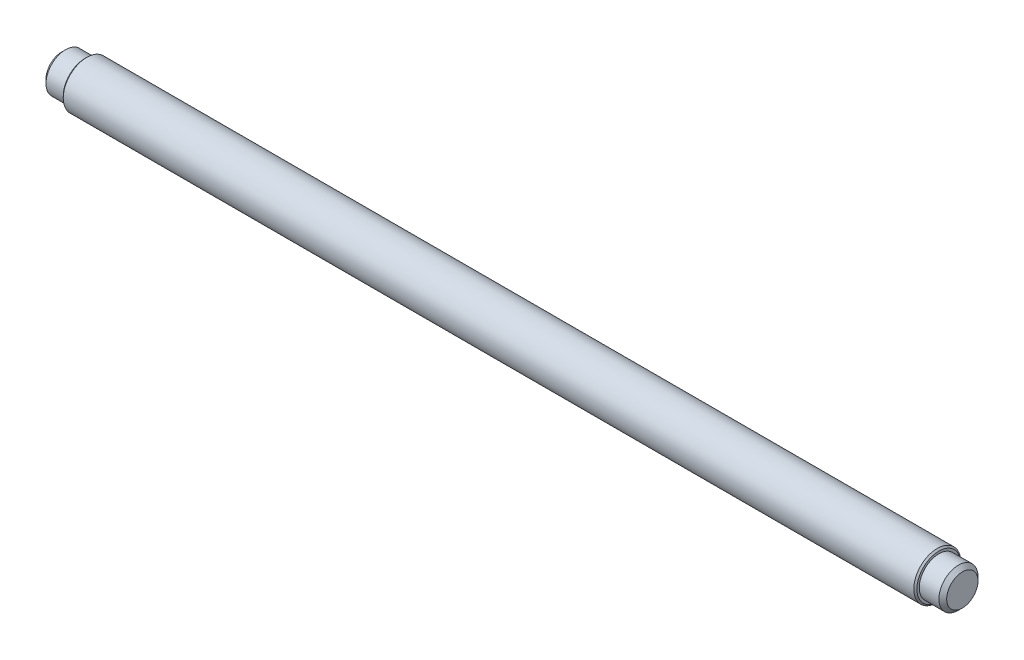
ISO-10303-21;
HEADER;
FILE_DESCRIPTION(('STEP AP214'),'2;1');
FILE_NAME('part.step','',(''),(''),'','','');
FILE_SCHEMA(('AUTOMOTIVE_DESIGN { 1 0 10303 214 1 1 1 1 }'));
ENDSEC;
DATA;
#1=APPLICATION_CONTEXT('core data for automotive mechanical design processes');
#2=APPLICATION_PROTOCOL_DEFINITION('international standard','automotive_design',2000,#1);
#3=PRODUCT_CONTEXT('',#1,'mechanical');
#4=PRODUCT('Part','Part','',(#3));
#5=PRODUCT_RELATED_PRODUCT_CATEGORY('part','',(#4));
#6=PRODUCT_DEFINITION_FORMATION('','',#4);
#7=PRODUCT_DEFINITION_CONTEXT('part definition',#1,'design');
#8=PRODUCT_DEFINITION('design','',#6,#7);
#9=PRODUCT_DEFINITION_SHAPE('','',#8);
#10=(LENGTH_UNIT() NAMED_UNIT(*) SI_UNIT(.MILLI.,.METRE.));
#11=(NAMED_UNIT(*) PLANE_ANGLE_UNIT() SI_UNIT($,.RADIAN.));
#12=(NAMED_UNIT(*) SI_UNIT($,.STERADIAN.) SOLID_ANGLE_UNIT());
#13=UNCERTAINTY_MEASURE_WITH_UNIT(LENGTH_MEASURE(1.E-05),#10,'distance_accuracy_value','');
#14=(GEOMETRIC_REPRESENTATION_CONTEXT(3) GLOBAL_UNCERTAINTY_ASSIGNED_CONTEXT((#13)) GLOBAL_UNIT_ASSIGNED_CONTEXT((#10,
#11,#12)) REPRESENTATION_CONTEXT('',''));
#15=CARTESIAN_POINT('',(0.,0.,0.));
#16=DIRECTION('',(0.,0.,1.));
#17=DIRECTION('',(1.,0.,0.));
#18=AXIS2_PLACEMENT_3D('',#15,#16,#17);
#19=CARTESIAN_POINT('',(115.,2.5,0.));
#20=DIRECTION('',(-1.,0.,0.));
#21=DIRECTION('',(0.,0.,1.));
#22=AXIS2_PLACEMENT_3D('',#19,#20,#21);
#23=PLANE('',#22);
#24=CARTESIAN_POINT('',(115.,0.,0.));
#25=DIRECTION('',(-1.,0.,0.));
#26=DIRECTION('',(0.,0.,1.));
#27=AXIS2_PLACEMENT_3D('',#24,#25,#26);
#28=CIRCLE('',#27,1.99999999999999);
#29=CARTESIAN_POINT('',(115.,0.,1.99999999999999));
#30=VERTEX_POINT('',#29);
#31=EDGE_CURVE('E10',#30,#30,#28,.F.);
#32=ORIENTED_EDGE('',*,*,#31,.T.);
#33=EDGE_LOOP('',(#32));
#34=FACE_BOUND('',#33,.T.);
#35=ADVANCED_FACE('F35',(#34),#23,.F.);
#36=CARTESIAN_POINT('',(0.,0.,0.));
#37=DIRECTION('',(-1.,0.,0.));
#38=DIRECTION('',(0.,0.,1.));
#39=AXIS2_PLACEMENT_3D('',#36,#37,#38);
#40=CYLINDRICAL_SURFACE('',#39,2.5);
#41=CARTESIAN_POINT('',(114.5,0.,0.));
#42=DIRECTION('',(-1.,0.,0.));
#43=DIRECTION('',(0.,0.,1.));
#44=AXIS2_PLACEMENT_3D('',#41,#42,#43);
#45=CIRCLE('',#44,2.5);
#46=CARTESIAN_POINT('',(114.5,0.,2.5));
#47=VERTEX_POINT('',#46);
#48=EDGE_CURVE('E42',#47,#47,#45,.T.);
#49=ORIENTED_EDGE('',*,*,#48,.T.);
#50=EDGE_LOOP('',(#49));
#51=FACE_BOUND('',#50,.T.);
#52=CARTESIAN_POINT('',(112.,0.,0.));
#53=DIRECTION('',(-1.,0.,0.));
#54=DIRECTION('',(0.,0.,1.));
#55=AXIS2_PLACEMENT_3D('',#52,#53,#54);
#56=CIRCLE('',#55,2.5);
#57=CARTESIAN_POINT('',(112.,0.,2.5));
#58=VERTEX_POINT('',#57);
#59=EDGE_CURVE('E67',#58,#58,#56,.T.);
#60=ORIENTED_EDGE('',*,*,#59,.F.);
#61=EDGE_LOOP('',(#60));
#62=FACE_BOUND('',#61,.T.);
#63=ADVANCED_FACE('F92',(#51,#62),#40,.T.);
#64=CARTESIAN_POINT('',(112.,2.5,0.));
#65=DIRECTION('',(-1.,0.,0.));
#66=DIRECTION('',(0.,0.,1.));
#67=AXIS2_PLACEMENT_3D('',#64,#65,#66);
#68=PLANE('',#67);
#69=CARTESIAN_POINT('',(112.,0.,0.));
#70=DIRECTION('',(-1.,0.,0.));
#71=DIRECTION('',(0.,0.,1.));
#72=AXIS2_PLACEMENT_3D('',#69,#70,#71);
#73=CIRCLE('',#72,2.80000000000001);
#74=CARTESIAN_POINT('',(112.,0.,2.8));
#75=VERTEX_POINT('',#74);
#76=EDGE_CURVE('E61',#75,#75,#73,.F.);
#77=ORIENTED_EDGE('',*,*,#76,.T.);
#78=EDGE_LOOP('',(#77));
#79=FACE_BOUND('',#78,.T.);
#80=ORIENTED_EDGE('',*,*,#59,.T.);
#81=EDGE_LOOP('',(#80));
#82=FACE_BOUND('',#81,.T.);
#83=ADVANCED_FACE('F88',(#79,#82),#68,.F.);
#84=CARTESIAN_POINT('',(0.,0.,0.));
#85=DIRECTION('',(-1.,0.,0.));
#86=DIRECTION('',(0.,0.,1.));
#87=AXIS2_PLACEMENT_3D('',#84,#85,#86);
#88=CYLINDRICAL_SURFACE('',#87,3.);
#89=CARTESIAN_POINT('',(3.20000000000003,0.,0.));
#90=DIRECTION('',(1.,0.,0.));
#91=DIRECTION('',(0.,0.,-1.));
#92=AXIS2_PLACEMENT_3D('',#89,#90,#91);
#93=CIRCLE('',#92,3.);
#94=CARTESIAN_POINT('',(3.20000000000003,0.,3.));
#95=VERTEX_POINT('',#94);
#96=EDGE_CURVE('E55',#95,#95,#93,.T.);
#97=CARTESIAN_POINT('',(111.8,0.,0.));
#98=DIRECTION('',(-1.,0.,0.));
#99=DIRECTION('',(0.,0.,1.));
#100=AXIS2_PLACEMENT_3D('',#97,#98,#99);
#101=CIRCLE('',#100,3.);
#102=CARTESIAN_POINT('',(111.8,0.,3.));
#103=VERTEX_POINT('',#102);
#104=EDGE_CURVE('E64',#103,#103,#101,.T.);
#105=CARTESIAN_POINT('',(3.20000000000003,0.,3.));
#106=CARTESIAN_POINT('',(4.33125000000003,0.,3.));
#107=CARTESIAN_POINT('',(5.46250000000003,0.,3.));
#108=CARTESIAN_POINT('',(7.72500000000003,0.,3.));
#109=CARTESIAN_POINT('',(8.85625000000003,0.,3.));
#110=CARTESIAN_POINT('',(11.11875,0.,3.));
#111=CARTESIAN_POINT('',(12.25,0.,3.));
#112=CARTESIAN_POINT('',(14.5125,0.,3.));
#113=CARTESIAN_POINT('',(15.64375,0.,3.));
#114=CARTESIAN_POINT('',(17.90625,0.,3.));
#115=CARTESIAN_POINT('',(19.0375,0.,3.));
#116=CARTESIAN_POINT('',(21.3,0.,3.));
#117=CARTESIAN_POINT('',(22.43125,0.,3.));
#118=CARTESIAN_POINT('',(24.69375,0.,3.));
#119=CARTESIAN_POINT('',(25.825,0.,3.));
#120=CARTESIAN_POINT('',(28.0875,0.,3.));
#121=CARTESIAN_POINT('',(29.21875,0.,3.));
#122=CARTESIAN_POINT('',(31.48125,0.,3.));
#123=CARTESIAN_POINT('',(32.6125,0.,3.));
#124=CARTESIAN_POINT('',(34.875,0.,3.));
#125=CARTESIAN_POINT('',(36.00625,0.,3.));
#126=CARTESIAN_POINT('',(38.26875,0.,3.));
#127=CARTESIAN_POINT('',(39.4,0.,3.));
#128=CARTESIAN_POINT('',(41.6625,0.,3.));
#129=CARTESIAN_POINT('',(42.79375,0.,3.));
#130=CARTESIAN_POINT('',(45.05625,0.,3.));
#131=CARTESIAN_POINT('',(46.1875,0.,3.));
#132=CARTESIAN_POINT('',(48.45,0.,3.));
#133=CARTESIAN_POINT('',(49.58125,0.,3.));
#134=CARTESIAN_POINT('',(51.84375,0.,3.));
#135=CARTESIAN_POINT('',(52.975,0.,3.));
#136=CARTESIAN_POINT('',(55.2375,0.,3.));
#137=CARTESIAN_POINT('',(56.36875,0.,3.));
#138=CARTESIAN_POINT('',(58.63125,0.,3.));
#139=CARTESIAN_POINT('',(59.7625,0.,3.));
#140=CARTESIAN_POINT('',(62.025,0.,3.));
#141=CARTESIAN_POINT('',(63.15625,0.,3.));
#142=CARTESIAN_POINT('',(65.41875,0.,3.));
#143=CARTESIAN_POINT('',(66.55,0.,3.));
#144=CARTESIAN_POINT('',(68.8125,0.,3.));
#145=CARTESIAN_POINT('',(69.94375,0.,3.));
#146=CARTESIAN_POINT('',(72.20625,0.,3.));
#147=CARTESIAN_POINT('',(73.3375,0.,3.));
#148=CARTESIAN_POINT('',(75.6,0.,3.));
#149=CARTESIAN_POINT('',(76.73125,0.,3.));
#150=CARTESIAN_POINT('',(78.99375,0.,3.));
#151=CARTESIAN_POINT('',(80.125,0.,3.));
#152=CARTESIAN_POINT('',(82.3875,0.,3.));
#153=CARTESIAN_POINT('',(83.51875,0.,3.));
#154=CARTESIAN_POINT('',(85.78125,0.,3.));
#155=CARTESIAN_POINT('',(86.9125,0.,3.));
#156=CARTESIAN_POINT('',(89.175,0.,3.));
#157=CARTESIAN_POINT('',(90.30625,0.,3.));
#158=CARTESIAN_POINT('',(92.56875,0.,3.));
#159=CARTESIAN_POINT('',(93.7,0.,3.));
#160=CARTESIAN_POINT('',(95.9625,0.,3.));
#161=CARTESIAN_POINT('',(97.09375,0.,3.));
#162=CARTESIAN_POINT('',(99.35625,0.,3.));
#163=CARTESIAN_POINT('',(100.4875,0.,3.));
#164=CARTESIAN_POINT('',(102.75,0.,3.));
#165=CARTESIAN_POINT('',(103.88125,0.,3.));
#166=CARTESIAN_POINT('',(106.14375,0.,3.));
#167=CARTESIAN_POINT('',(107.275,0.,3.));
#168=CARTESIAN_POINT('',(109.5375,0.,3.));
#169=CARTESIAN_POINT('',(110.66875,0.,3.));
#170=CARTESIAN_POINT('',(111.8,0.,3.));
#171=B_SPLINE_CURVE_WITH_KNOTS('',3,(#105,#106,#107,#108,#109,#110,#111,#112,#113,#114,#115,
#116,#117,#118,#119,#120,#121,#122,#123,#124,#125,#126,#127,#128,#129,#130,#131,#132,#133,#134,
#135,#136,#137,#138,#139,#140,#141,#142,#143,#144,#145,#146,#147,#148,#149,#150,#151,#152,#153,
#154,#155,#156,#157,#158,#159,#160,#161,#162,#163,#164,#165,#166,#167,#168,#169,#170),
.UNSPECIFIED.,.F.,.F.,(4,2,2,2,2,2,2,2,2,2,2,2,2,2,2,2,2,2,2,2,2,2,2,2,2,2,2,2,2,2,2,2,4),(0.,
3.39375,6.7875,10.18125,13.575,16.96875,20.3625,23.75625,27.15,30.54375,33.9375,37.33125,40.725,
44.11875,47.5125,50.90625,54.3,57.69375,61.0875,64.48125,67.875,71.26875,74.6625,78.05625,81.45,
84.84375,88.2375,91.63125,95.025,98.41875,101.8125,105.20625,108.6),.UNSPECIFIED.);
#172=EDGE_CURVE('BSEAM78',#95,#103,#171,.T.);
#173=ORIENTED_EDGE('',*,*,#96,.T.);
#174=ORIENTED_EDGE('',*,*,#104,.T.);
#175=ORIENTED_EDGE('',*,*,#172,.T.);
#176=ORIENTED_EDGE('',*,*,#172,.F.);
#177=EDGE_LOOP('',(#173,#175,#174,#176));
#178=FACE_BOUND('',#177,.T.);
#179=ADVANCED_FACE('F78',(#178),#88,.T.);
#180=CARTESIAN_POINT('',(3.,2.99999999999999,0.));
#181=DIRECTION('',(1.,0.,0.));
#182=DIRECTION('',(0.,0.,-1.));
#183=AXIS2_PLACEMENT_3D('',#180,#181,#182);
#184=PLANE('',#183);
#185=CARTESIAN_POINT('',(3.,0.,0.));
#186=DIRECTION('',(1.,0.,0.));
#187=DIRECTION('',(0.,0.,-1.));
#188=AXIS2_PLACEMENT_3D('',#185,#186,#187);
#189=CIRCLE('',#188,2.79999999999998);
#190=CARTESIAN_POINT('',(3.,0.,-2.79999999999998));
#191=VERTEX_POINT('',#190);
#192=EDGE_CURVE('E58',#191,#191,#189,.F.);
#193=ORIENTED_EDGE('',*,*,#192,.T.);
#194=EDGE_LOOP('',(#193));
#195=FACE_BOUND('',#194,.T.);
#196=CARTESIAN_POINT('',(3.,0.,0.));
#197=DIRECTION('',(-1.,0.,0.));
#198=DIRECTION('',(0.,0.,1.));
#199=AXIS2_PLACEMENT_3D('',#196,#197,#198);
#200=CIRCLE('',#199,2.5);
#201=CARTESIAN_POINT('',(3.,0.,2.5));
#202=VERTEX_POINT('',#201);
#203=EDGE_CURVE('E70',#202,#202,#200,.T.);
#204=ORIENTED_EDGE('',*,*,#203,.F.);
#205=EDGE_LOOP('',(#204));
#206=FACE_BOUND('',#205,.T.);
#207=ADVANCED_FACE('F76',(#195,#206),#184,.F.);
#208=CARTESIAN_POINT('',(0.,0.,0.));
#209=DIRECTION('',(-1.,0.,0.));
#210=DIRECTION('',(0.,0.,1.));
#211=AXIS2_PLACEMENT_3D('',#208,#209,#210);
#212=CYLINDRICAL_SURFACE('',#211,2.5);
#213=CARTESIAN_POINT('',(0.499999999999977,0.,0.));
#214=DIRECTION('',(1.,0.,0.));
#215=DIRECTION('',(0.,0.,-1.));
#216=AXIS2_PLACEMENT_3D('',#213,#214,#215);
#217=CIRCLE('',#216,2.5);
#218=CARTESIAN_POINT('',(0.499999999999977,0.,-2.5));
#219=VERTEX_POINT('',#218);
#220=EDGE_CURVE('E46',#219,#219,#217,.T.);
#221=ORIENTED_EDGE('',*,*,#220,.T.);
#222=EDGE_LOOP('',(#221));
#223=FACE_BOUND('',#222,.T.);
#224=ORIENTED_EDGE('',*,*,#203,.T.);
#225=EDGE_LOOP('',(#224));
#226=FACE_BOUND('',#225,.T.);
#227=ADVANCED_FACE('F74',(#223,#226),#212,.T.);
#228=CARTESIAN_POINT('',(0.,2.5,0.));
#229=DIRECTION('',(1.,0.,0.));
#230=DIRECTION('',(0.,0.,-1.));
#231=AXIS2_PLACEMENT_3D('',#228,#229,#230);
#232=PLANE('',#231);
#233=CARTESIAN_POINT('',(0.,0.,0.));
#234=DIRECTION('',(1.,0.,0.));
#235=DIRECTION('',(0.,0.,-1.));
#236=AXIS2_PLACEMENT_3D('',#233,#234,#235);
#237=CIRCLE('',#236,2.00000000000002);
#238=CARTESIAN_POINT('',(0.,0.,-2.00000000000002));
#239=VERTEX_POINT('',#238);
#240=EDGE_CURVE('E50',#239,#239,#237,.F.);
#241=ORIENTED_EDGE('',*,*,#240,.T.);
#242=EDGE_LOOP('',(#241));
#243=FACE_BOUND('',#242,.T.);
#244=ADVANCED_FACE('F85',(#243),#232,.F.);
#245=CARTESIAN_POINT('',(111.8,0.,0.));
#246=DIRECTION('',(-1.,0.,0.));
#247=DIRECTION('',(0.,0.,1.));
#248=AXIS2_PLACEMENT_3D('',#245,#246,#247);
#249=CONICAL_SURFACE('',#248,3.,0.785398163397474);
#250=CARTESIAN_POINT('',(112.,0.,2.8));
#251=CARTESIAN_POINT('',(111.997916666667,0.,2.80208333333334));
#252=CARTESIAN_POINT('',(111.995833333333,0.,2.80416666666667));
#253=CARTESIAN_POINT('',(111.991666666667,0.,2.80833333333334));
#254=CARTESIAN_POINT('',(111.989583333333,0.,2.81041666666667));
#255=CARTESIAN_POINT('',(111.985416666667,0.,2.81458333333334));
#256=CARTESIAN_POINT('',(111.983333333333,0.,2.81666666666667));
#257=CARTESIAN_POINT('',(111.979166666667,0.,2.82083333333334));
#258=CARTESIAN_POINT('',(111.977083333333,0.,2.82291666666667));
#259=CARTESIAN_POINT('',(111.972916666667,0.,2.82708333333334));
#260=CARTESIAN_POINT('',(111.970833333333,0.,2.82916666666667));
#261=CARTESIAN_POINT('',(111.966666666667,0.,2.83333333333334));
#262=CARTESIAN_POINT('',(111.964583333333,0.,2.83541666666667));
#263=CARTESIAN_POINT('',(111.960416666667,0.,2.83958333333333));
#264=CARTESIAN_POINT('',(111.958333333333,0.,2.84166666666667));
#265=CARTESIAN_POINT('',(111.954166666667,0.,2.84583333333333));
#266=CARTESIAN_POINT('',(111.952083333333,0.,2.84791666666667));
#267=CARTESIAN_POINT('',(111.947916666667,0.,2.85208333333333));
#268=CARTESIAN_POINT('',(111.945833333333,0.,2.85416666666667));
#269=CARTESIAN_POINT('',(111.941666666667,0.,2.85833333333333));
#270=CARTESIAN_POINT('',(111.939583333333,0.,2.86041666666667));
#271=CARTESIAN_POINT('',(111.935416666667,0.,2.86458333333333));
#272=CARTESIAN_POINT('',(111.933333333333,0.,2.86666666666667));
#273=CARTESIAN_POINT('',(111.929166666667,0.,2.87083333333333));
#274=CARTESIAN_POINT('',(111.927083333333,0.,2.87291666666667));
#275=CARTESIAN_POINT('',(111.922916666667,0.,2.87708333333333));
#276=CARTESIAN_POINT('',(111.920833333333,0.,2.87916666666667));
#277=CARTESIAN_POINT('',(111.916666666667,0.,2.88333333333333));
#278=CARTESIAN_POINT('',(111.914583333333,0.,2.88541666666667));
#279=CARTESIAN_POINT('',(111.910416666667,0.,2.88958333333333));
#280=CARTESIAN_POINT('',(111.908333333333,0.,2.89166666666667));
#281=CARTESIAN_POINT('',(111.904166666667,0.,2.89583333333333));
#282=CARTESIAN_POINT('',(111.902083333333,0.,2.89791666666666));
#283=CARTESIAN_POINT('',(111.897916666667,0.,2.90208333333333));
#284=CARTESIAN_POINT('',(111.895833333333,0.,2.90416666666666));
#285=CARTESIAN_POINT('',(111.891666666667,0.,2.90833333333333));
#286=CARTESIAN_POINT('',(111.889583333333,0.,2.91041666666666));
#287=CARTESIAN_POINT('',(111.885416666667,0.,2.91458333333333));
#288=CARTESIAN_POINT('',(111.883333333333,0.,2.91666666666666));
#289=CARTESIAN_POINT('',(111.879166666667,0.,2.92083333333333));
#290=CARTESIAN_POINT('',(111.877083333333,0.,2.92291666666666));
#291=CARTESIAN_POINT('',(111.872916666667,0.,2.92708333333333));
#292=CARTESIAN_POINT('',(111.870833333333,0.,2.92916666666666));
#293=CARTESIAN_POINT('',(111.866666666667,0.,2.93333333333333));
#294=CARTESIAN_POINT('',(111.864583333333,0.,2.93541666666666));
#295=CARTESIAN_POINT('',(111.860416666667,0.,2.93958333333333));
#296=CARTESIAN_POINT('',(111.858333333333,0.,2.94166666666666));
#297=CARTESIAN_POINT('',(111.854166666667,0.,2.94583333333333));
#298=CARTESIAN_POINT('',(111.852083333333,0.,2.94791666666666));
#299=CARTESIAN_POINT('',(111.847916666667,0.,2.95208333333333));
#300=CARTESIAN_POINT('',(111.845833333333,0.,2.95416666666666));
#301=CARTESIAN_POINT('',(111.841666666667,0.,2.95833333333333));
#302=CARTESIAN_POINT('',(111.839583333333,0.,2.96041666666666));
#303=CARTESIAN_POINT('',(111.835416666667,0.,2.96458333333333));
#304=CARTESIAN_POINT('',(111.833333333333,0.,2.96666666666666));
#305=CARTESIAN_POINT('',(111.829166666667,0.,2.97083333333333));
#306=CARTESIAN_POINT('',(111.827083333333,0.,2.97291666666666));
#307=CARTESIAN_POINT('',(111.822916666667,0.,2.97708333333333));
#308=CARTESIAN_POINT('',(111.820833333333,0.,2.97916666666666));
#309=CARTESIAN_POINT('',(111.816666666667,0.,2.98333333333333));
#310=CARTESIAN_POINT('',(111.814583333333,0.,2.98541666666666));
#311=CARTESIAN_POINT('',(111.810416666667,0.,2.98958333333333));
#312=CARTESIAN_POINT('',(111.808333333333,0.,2.99166666666666));
#313=CARTESIAN_POINT('',(111.804166666667,0.,2.99583333333333));
#314=CARTESIAN_POINT('',(111.802083333333,0.,2.99791666666666));
#315=CARTESIAN_POINT('',(111.8,0.,2.99999999999999));
#316=B_SPLINE_CURVE_WITH_KNOTS('',3,(#250,#251,#252,#253,#254,#255,#256,#257,#258,#259,#260,
#261,#262,#263,#264,#265,#266,#267,#268,#269,#270,#271,#272,#273,#274,#275,#276,#277,#278,#279,
#280,#281,#282,#283,#284,#285,#286,#287,#288,#289,#290,#291,#292,#293,#294,#295,#296,#297,#298,
#299,#300,#301,#302,#303,#304,#305,#306,#307,#308,#309,#310,#311,#312,#313,#314,#315),
.UNSPECIFIED.,.F.,.F.,(4,2,2,2,2,2,2,2,2,2,2,2,2,2,2,2,2,2,2,2,2,2,2,2,2,2,2,2,2,2,2,2,4),(0.,
0.00883883476483118,0.0176776695296624,0.0265165042944932,0.0353553390593244,0.0441941738241556,
0.0530330085889864,0.0618718433538176,0.0707106781186488,0.07954951288348,0.0883883476483112,
0.097227182413142,0.106066017177973,0.114904851942804,0.123743686707636,0.132582521472466,
0.141421356237298,0.150260191002129,0.15909902576696,0.167937860531791,0.176776695296622,
0.185615530061453,0.194454364826284,0.203293199591115,0.212132034355946,0.220970869120778,
0.229809703885609,0.23864853865044,0.247487373415271,0.256326208180102,0.265165042944933,
0.274003877709764,0.282842712474595),.UNSPECIFIED.);
#317=EDGE_CURVE('BSEAM100',#75,#103,#316,.T.);
#318=ORIENTED_EDGE('',*,*,#76,.F.);
#319=ORIENTED_EDGE('',*,*,#104,.F.);
#320=ORIENTED_EDGE('',*,*,#317,.T.);
#321=ORIENTED_EDGE('',*,*,#317,.F.);
#322=EDGE_LOOP('',(#318,#320,#319,#321));
#323=FACE_BOUND('',#322,.T.);
#324=ADVANCED_FACE('F100',(#323),#249,.T.);
#325=CARTESIAN_POINT('',(3.,0.,0.));
#326=DIRECTION('',(1.,0.,0.));
#327=DIRECTION('',(0.,0.,-1.));
#328=AXIS2_PLACEMENT_3D('',#325,#326,#327);
#329=CONICAL_SURFACE('',#328,2.79999999999998,0.785398163397408);
#330=ORIENTED_EDGE('',*,*,#96,.F.);
#331=EDGE_LOOP('',(#330));
#332=FACE_BOUND('',#331,.T.);
#333=ORIENTED_EDGE('',*,*,#192,.F.);
#334=EDGE_LOOP('',(#333));
#335=FACE_BOUND('',#334,.T.);
#336=ADVANCED_FACE('F103',(#332,#335),#329,.T.);
#337=CARTESIAN_POINT('',(0.,0.,0.));
#338=DIRECTION('',(1.,0.,0.));
#339=DIRECTION('',(0.,0.,-1.));
#340=AXIS2_PLACEMENT_3D('',#337,#338,#339);
#341=CONICAL_SURFACE('',#340,2.00000000000002,0.785398163397453);
#342=ORIENTED_EDGE('',*,*,#220,.F.);
#343=EDGE_LOOP('',(#342));
#344=FACE_BOUND('',#343,.T.);
#345=ORIENTED_EDGE('',*,*,#240,.F.);
#346=EDGE_LOOP('',(#345));
#347=FACE_BOUND('',#346,.T.);
#348=ADVANCED_FACE('F106',(#344,#347),#341,.T.);
#349=CARTESIAN_POINT('',(114.5,0.,0.));
#350=DIRECTION('',(-1.,0.,0.));
#351=DIRECTION('',(0.,0.,1.));
#352=AXIS2_PLACEMENT_3D('',#349,#350,#351);
#353=CONICAL_SURFACE('',#352,2.5,0.785398163397446);
#354=ORIENTED_EDGE('',*,*,#31,.F.);
#355=EDGE_LOOP('',(#354));
#356=FACE_BOUND('',#355,.T.);
#357=ORIENTED_EDGE('',*,*,#48,.F.);
#358=EDGE_LOOP('',(#357));
#359=FACE_BOUND('',#358,.T.);
#360=ADVANCED_FACE('F37',(#356,#359),#353,.T.);
#361=CLOSED_SHELL('',(#35,#63,#83,#179,#207,#227,#244,#324,#336,#348,#360));
#362=MANIFOLD_SOLID_BREP('B2',#361);
#363=ADVANCED_BREP_SHAPE_REPRESENTATION('',(#18,#362),#14);
#364=SHAPE_DEFINITION_REPRESENTATION(#9,#363);
ENDSEC;
END-ISO-10303-21;
